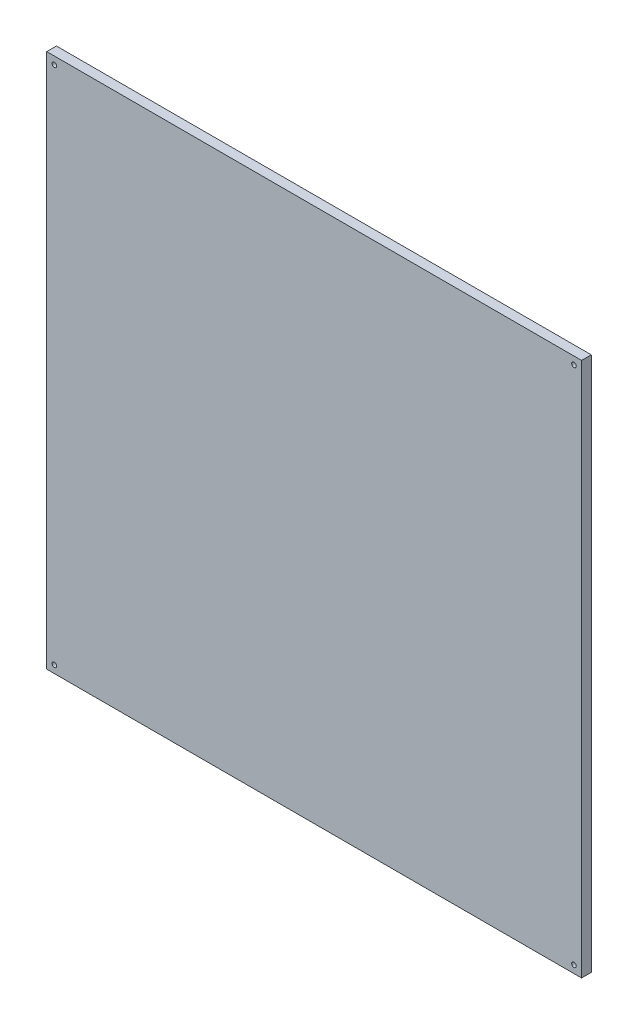
ISO-10303-21;
HEADER;
FILE_DESCRIPTION(('STEP AP214'),'2;1');
FILE_NAME('part.step','',(''),(''),'','','');
FILE_SCHEMA(('AUTOMOTIVE_DESIGN { 1 0 10303 214 1 1 1 1 }'));
ENDSEC;
DATA;
#1=APPLICATION_CONTEXT('core data for automotive mechanical design processes');
#2=APPLICATION_PROTOCOL_DEFINITION('international standard','automotive_design',2000,#1);
#3=PRODUCT_CONTEXT('',#1,'mechanical');
#4=PRODUCT('Part','Part','',(#3));
#5=PRODUCT_RELATED_PRODUCT_CATEGORY('part','',(#4));
#6=PRODUCT_DEFINITION_FORMATION('','',#4);
#7=PRODUCT_DEFINITION_CONTEXT('part definition',#1,'design');
#8=PRODUCT_DEFINITION('design','',#6,#7);
#9=PRODUCT_DEFINITION_SHAPE('','',#8);
#10=(LENGTH_UNIT() NAMED_UNIT(*) SI_UNIT(.MILLI.,.METRE.));
#11=(NAMED_UNIT(*) PLANE_ANGLE_UNIT() SI_UNIT($,.RADIAN.));
#12=(NAMED_UNIT(*) SI_UNIT($,.STERADIAN.) SOLID_ANGLE_UNIT());
#13=UNCERTAINTY_MEASURE_WITH_UNIT(LENGTH_MEASURE(1.E-05),#10,'distance_accuracy_value','');
#14=(GEOMETRIC_REPRESENTATION_CONTEXT(3) GLOBAL_UNCERTAINTY_ASSIGNED_CONTEXT((#13)) GLOBAL_UNIT_ASSIGNED_CONTEXT((#10,
#11,#12)) REPRESENTATION_CONTEXT('',''));
#15=CARTESIAN_POINT('',(0.,0.,0.));
#16=DIRECTION('',(0.,0.,1.));
#17=DIRECTION('',(1.,0.,0.));
#18=AXIS2_PLACEMENT_3D('',#15,#16,#17);
#19=CARTESIAN_POINT('',(0.,0.,6.35));
#20=DIRECTION('',(1.,0.,0.));
#21=DIRECTION('',(0.,0.,-1.));
#22=AXIS2_PLACEMENT_3D('',#19,#20,#21);
#23=PLANE('',#22);
#24=DIRECTION('',(0.,-1.,0.));
#25=VECTOR('',#24,1.);
#26=CARTESIAN_POINT('',(0.,0.,0.));
#27=LINE('',#26,#25);
#28=CARTESIAN_POINT('',(0.,350.,0.));
#29=VERTEX_POINT('',#28);
#30=CARTESIAN_POINT('',(0.,0.,0.));
#31=VERTEX_POINT('',#30);
#32=EDGE_CURVE('E109',#29,#31,#27,.T.);
#33=ORIENTED_EDGE('',*,*,#32,.T.);
#34=DIRECTION('',(0.,0.,-1.));
#35=VECTOR('',#34,1.);
#36=CARTESIAN_POINT('',(0.,0.,6.35));
#37=LINE('',#36,#35);
#38=CARTESIAN_POINT('',(0.,0.,6.35));
#39=VERTEX_POINT('',#38);
#40=EDGE_CURVE('E11',#39,#31,#37,.T.);
#41=ORIENTED_EDGE('',*,*,#40,.F.);
#42=DIRECTION('',(0.,-1.,0.));
#43=VECTOR('',#42,1.);
#44=CARTESIAN_POINT('',(0.,0.,6.35));
#45=LINE('',#44,#43);
#46=CARTESIAN_POINT('',(0.,350.,6.35));
#47=VERTEX_POINT('',#46);
#48=EDGE_CURVE('E92',#47,#39,#45,.T.);
#49=ORIENTED_EDGE('',*,*,#48,.F.);
#50=DIRECTION('',(0.,0.,-1.));
#51=VECTOR('',#50,1.);
#52=CARTESIAN_POINT('',(0.,350.,6.35));
#53=LINE('',#52,#51);
#54=EDGE_CURVE('E105',#47,#29,#53,.T.);
#55=ORIENTED_EDGE('',*,*,#54,.T.);
#56=EDGE_LOOP('',(#33,#41,#49,#55));
#57=FACE_BOUND('',#56,.T.);
#58=ADVANCED_FACE('F38',(#57),#23,.F.);
#59=CARTESIAN_POINT('',(0.,0.,6.35));
#60=DIRECTION('',(0.,1.,0.));
#61=DIRECTION('',(0.,0.,1.));
#62=AXIS2_PLACEMENT_3D('',#59,#60,#61);
#63=PLANE('',#62);
#64=DIRECTION('',(1.,0.,0.));
#65=VECTOR('',#64,1.);
#66=CARTESIAN_POINT('',(0.,0.,0.));
#67=LINE('',#66,#65);
#68=CARTESIAN_POINT('',(350.,0.,0.));
#69=VERTEX_POINT('',#68);
#70=EDGE_CURVE('E97',#31,#69,#67,.T.);
#71=ORIENTED_EDGE('',*,*,#70,.T.);
#72=DIRECTION('',(0.,0.,-1.));
#73=VECTOR('',#72,1.);
#74=CARTESIAN_POINT('',(350.,0.,6.35));
#75=LINE('',#74,#73);
#76=CARTESIAN_POINT('',(350.,0.,6.35));
#77=VERTEX_POINT('',#76);
#78=EDGE_CURVE('E48',#77,#69,#75,.T.);
#79=ORIENTED_EDGE('',*,*,#78,.F.);
#80=DIRECTION('',(1.,0.,0.));
#81=VECTOR('',#80,1.);
#82=CARTESIAN_POINT('',(0.,0.,6.35));
#83=LINE('',#82,#81);
#84=EDGE_CURVE('E87',#39,#77,#83,.T.);
#85=ORIENTED_EDGE('',*,*,#84,.F.);
#86=ORIENTED_EDGE('',*,*,#40,.T.);
#87=EDGE_LOOP('',(#71,#79,#85,#86));
#88=FACE_BOUND('',#87,.T.);
#89=ADVANCED_FACE('F96',(#88),#63,.F.);
#90=CARTESIAN_POINT('',(350.,0.,6.35));
#91=DIRECTION('',(-1.,0.,0.));
#92=DIRECTION('',(0.,-1.,0.));
#93=AXIS2_PLACEMENT_3D('',#90,#91,#92);
#94=PLANE('',#93);
#95=DIRECTION('',(0.,1.,0.));
#96=VECTOR('',#95,1.);
#97=CARTESIAN_POINT('',(350.,0.,0.));
#98=LINE('',#97,#96);
#99=CARTESIAN_POINT('',(350.,350.,0.));
#100=VERTEX_POINT('',#99);
#101=EDGE_CURVE('E74',#69,#100,#98,.T.);
#102=ORIENTED_EDGE('',*,*,#101,.T.);
#103=DIRECTION('',(0.,0.,-1.));
#104=VECTOR('',#103,1.);
#105=CARTESIAN_POINT('',(350.,350.,6.35));
#106=LINE('',#105,#104);
#107=CARTESIAN_POINT('',(350.,350.,6.35));
#108=VERTEX_POINT('',#107);
#109=EDGE_CURVE('E99',#108,#100,#106,.T.);
#110=ORIENTED_EDGE('',*,*,#109,.F.);
#111=DIRECTION('',(0.,1.,0.));
#112=VECTOR('',#111,1.);
#113=CARTESIAN_POINT('',(350.,0.,6.35));
#114=LINE('',#113,#112);
#115=EDGE_CURVE('E90',#77,#108,#114,.T.);
#116=ORIENTED_EDGE('',*,*,#115,.F.);
#117=ORIENTED_EDGE('',*,*,#78,.T.);
#118=EDGE_LOOP('',(#102,#110,#116,#117));
#119=FACE_BOUND('',#118,.T.);
#120=ADVANCED_FACE('F101',(#119),#94,.F.);
#121=CARTESIAN_POINT('',(0.,350.,6.35));
#122=DIRECTION('',(0.,-1.,0.));
#123=DIRECTION('',(0.,0.,-1.));
#124=AXIS2_PLACEMENT_3D('',#121,#122,#123);
#125=PLANE('',#124);
#126=DIRECTION('',(-1.,0.,0.));
#127=VECTOR('',#126,1.);
#128=CARTESIAN_POINT('',(0.,350.,0.));
#129=LINE('',#128,#127);
#130=EDGE_CURVE('E80',#100,#29,#129,.T.);
#131=ORIENTED_EDGE('',*,*,#130,.T.);
#132=ORIENTED_EDGE('',*,*,#54,.F.);
#133=DIRECTION('',(-1.,0.,0.));
#134=VECTOR('',#133,1.);
#135=CARTESIAN_POINT('',(0.,350.,6.35));
#136=LINE('',#135,#134);
#137=EDGE_CURVE('E57',#108,#47,#136,.T.);
#138=ORIENTED_EDGE('',*,*,#137,.F.);
#139=ORIENTED_EDGE('',*,*,#109,.T.);
#140=EDGE_LOOP('',(#131,#132,#138,#139));
#141=FACE_BOUND('',#140,.T.);
#142=ADVANCED_FACE('F165',(#141),#125,.F.);
#143=CARTESIAN_POINT('',(0.,0.,6.35));
#144=DIRECTION('',(0.,0.,-1.));
#145=DIRECTION('',(-1.,0.,0.));
#146=AXIS2_PLACEMENT_3D('',#143,#144,#145);
#147=PLANE('',#146);
#148=CARTESIAN_POINT('',(345.019620057682,344.999999999999,6.35));
#149=DIRECTION('',(0.,0.,1.));
#150=DIRECTION('',(0.,-1.,0.));
#151=AXIS2_PLACEMENT_3D('',#148,#149,#150);
#152=CIRCLE('',#151,1.5);
#153=CARTESIAN_POINT('',(345.019620057682,343.499999999999,6.35));
#154=VERTEX_POINT('',#153);
#155=EDGE_CURVE('E132',#154,#154,#152,.T.);
#156=ORIENTED_EDGE('',*,*,#155,.F.);
#157=EDGE_LOOP('',(#156));
#158=FACE_BOUND('',#157,.T.);
#159=CARTESIAN_POINT('',(345.019620057682,4.98037994231826,6.35));
#160=DIRECTION('',(0.,0.,1.));
#161=DIRECTION('',(-1.,0.,0.));
#162=AXIS2_PLACEMENT_3D('',#159,#160,#161);
#163=CIRCLE('',#162,1.5);
#164=CARTESIAN_POINT('',(343.519620057682,4.98037994231826,6.35));
#165=VERTEX_POINT('',#164);
#166=EDGE_CURVE('E152',#165,#165,#163,.T.);
#167=ORIENTED_EDGE('',*,*,#166,.F.);
#168=EDGE_LOOP('',(#167));
#169=FACE_BOUND('',#168,.T.);
#170=CARTESIAN_POINT('',(4.99999999999817,4.98037994232006,6.35));
#171=DIRECTION('',(0.,0.,1.));
#172=DIRECTION('',(0.,1.,0.));
#173=AXIS2_PLACEMENT_3D('',#170,#171,#172);
#174=CIRCLE('',#173,1.5);
#175=CARTESIAN_POINT('',(4.99999999999819,6.48037994232006,6.35));
#176=VERTEX_POINT('',#175);
#177=EDGE_CURVE('E147',#176,#176,#174,.T.);
#178=ORIENTED_EDGE('',*,*,#177,.F.);
#179=EDGE_LOOP('',(#178));
#180=FACE_BOUND('',#179,.T.);
#181=CARTESIAN_POINT('',(5.,345.,6.35));
#182=DIRECTION('',(0.,0.,1.));
#183=DIRECTION('',(1.,0.,0.));
#184=AXIS2_PLACEMENT_3D('',#181,#182,#183);
#185=CIRCLE('',#184,1.5);
#186=CARTESIAN_POINT('',(6.5,345.,6.35));
#187=VERTEX_POINT('',#186);
#188=EDGE_CURVE('E127',#187,#187,#185,.T.);
#189=ORIENTED_EDGE('',*,*,#188,.F.);
#190=EDGE_LOOP('',(#189));
#191=FACE_BOUND('',#190,.T.);
#192=ORIENTED_EDGE('',*,*,#48,.T.);
#193=ORIENTED_EDGE('',*,*,#84,.T.);
#194=ORIENTED_EDGE('',*,*,#115,.T.);
#195=ORIENTED_EDGE('',*,*,#137,.T.);
#196=EDGE_LOOP('',(#192,#193,#194,#195));
#197=FACE_BOUND('',#196,.T.);
#198=ADVANCED_FACE('F88',(#158,#169,#180,#191,#197),#147,.F.);
#199=CARTESIAN_POINT('',(0.,0.,0.));
#200=DIRECTION('',(0.,0.,-1.));
#201=DIRECTION('',(-1.,0.,0.));
#202=AXIS2_PLACEMENT_3D('',#199,#200,#201);
#203=PLANE('',#202);
#204=CARTESIAN_POINT('',(345.019620057682,344.999999999999,0.));
#205=DIRECTION('',(0.,0.,-1.));
#206=DIRECTION('',(-1.,0.,0.));
#207=AXIS2_PLACEMENT_3D('',#204,#205,#206);
#208=CIRCLE('',#207,1.5);
#209=CARTESIAN_POINT('',(343.519620057682,344.999999999999,0.));
#210=VERTEX_POINT('',#209);
#211=EDGE_CURVE('E41',#210,#210,#208,.T.);
#212=ORIENTED_EDGE('',*,*,#211,.F.);
#213=EDGE_LOOP('',(#212));
#214=FACE_BOUND('',#213,.T.);
#215=CARTESIAN_POINT('',(345.019620057682,4.98037994231826,0.));
#216=DIRECTION('',(0.,0.,-1.));
#217=DIRECTION('',(-1.,0.,0.));
#218=AXIS2_PLACEMENT_3D('',#215,#216,#217);
#219=CIRCLE('',#218,1.5);
#220=CARTESIAN_POINT('',(343.519620057682,4.98037994231826,0.));
#221=VERTEX_POINT('',#220);
#222=EDGE_CURVE('E131',#221,#221,#219,.T.);
#223=ORIENTED_EDGE('',*,*,#222,.F.);
#224=EDGE_LOOP('',(#223));
#225=FACE_BOUND('',#224,.T.);
#226=CARTESIAN_POINT('',(4.99999999999817,4.98037994232006,0.));
#227=DIRECTION('',(0.,0.,-1.));
#228=DIRECTION('',(-1.,0.,0.));
#229=AXIS2_PLACEMENT_3D('',#226,#227,#228);
#230=CIRCLE('',#229,1.5);
#231=CARTESIAN_POINT('',(3.49999999999817,4.98037994232006,0.));
#232=VERTEX_POINT('',#231);
#233=EDGE_CURVE('E128',#232,#232,#230,.T.);
#234=ORIENTED_EDGE('',*,*,#233,.F.);
#235=EDGE_LOOP('',(#234));
#236=FACE_BOUND('',#235,.T.);
#237=CARTESIAN_POINT('',(5.,345.,0.));
#238=DIRECTION('',(0.,0.,-1.));
#239=DIRECTION('',(-1.,0.,0.));
#240=AXIS2_PLACEMENT_3D('',#237,#238,#239);
#241=CIRCLE('',#240,1.5);
#242=CARTESIAN_POINT('',(3.5,345.,0.));
#243=VERTEX_POINT('',#242);
#244=EDGE_CURVE('E113',#243,#243,#241,.T.);
#245=ORIENTED_EDGE('',*,*,#244,.F.);
#246=EDGE_LOOP('',(#245));
#247=FACE_BOUND('',#246,.T.);
#248=ORIENTED_EDGE('',*,*,#32,.F.);
#249=ORIENTED_EDGE('',*,*,#130,.F.);
#250=ORIENTED_EDGE('',*,*,#101,.F.);
#251=ORIENTED_EDGE('',*,*,#70,.F.);
#252=EDGE_LOOP('',(#248,#249,#250,#251));
#253=FACE_BOUND('',#252,.T.);
#254=ADVANCED_FACE('F164',(#214,#225,#236,#247,#253),#203,.T.);
#255=CARTESIAN_POINT('',(5.,345.,-3.65));
#256=DIRECTION('',(0.,0.,1.));
#257=DIRECTION('',(1.,0.,0.));
#258=AXIS2_PLACEMENT_3D('',#255,#256,#257);
#259=CYLINDRICAL_SURFACE('',#258,1.5);
#260=ORIENTED_EDGE('',*,*,#244,.T.);
#261=EDGE_LOOP('',(#260));
#262=FACE_BOUND('',#261,.T.);
#263=ORIENTED_EDGE('',*,*,#188,.T.);
#264=EDGE_LOOP('',(#263));
#265=FACE_BOUND('',#264,.T.);
#266=ADVANCED_FACE('F175',(#262,#265),#259,.F.);
#267=CARTESIAN_POINT('',(4.99999999999817,4.98037994232006,-3.65));
#268=DIRECTION('',(0.,0.,1.));
#269=DIRECTION('',(1.,0.,0.));
#270=AXIS2_PLACEMENT_3D('',#267,#268,#269);
#271=CYLINDRICAL_SURFACE('',#270,1.5);
#272=ORIENTED_EDGE('',*,*,#233,.T.);
#273=EDGE_LOOP('',(#272));
#274=FACE_BOUND('',#273,.T.);
#275=ORIENTED_EDGE('',*,*,#177,.T.);
#276=EDGE_LOOP('',(#275));
#277=FACE_BOUND('',#276,.T.);
#278=ADVANCED_FACE('F172',(#274,#277),#271,.F.);
#279=CARTESIAN_POINT('',(345.019620057682,4.98037994231826,-3.65));
#280=DIRECTION('',(0.,0.,1.));
#281=DIRECTION('',(1.,0.,0.));
#282=AXIS2_PLACEMENT_3D('',#279,#280,#281);
#283=CYLINDRICAL_SURFACE('',#282,1.5);
#284=ORIENTED_EDGE('',*,*,#222,.T.);
#285=EDGE_LOOP('',(#284));
#286=FACE_BOUND('',#285,.T.);
#287=ORIENTED_EDGE('',*,*,#166,.T.);
#288=EDGE_LOOP('',(#287));
#289=FACE_BOUND('',#288,.T.);
#290=ADVANCED_FACE('F174',(#286,#289),#283,.F.);
#291=CARTESIAN_POINT('',(345.019620057682,344.999999999999,-3.65));
#292=DIRECTION('',(0.,0.,1.));
#293=DIRECTION('',(1.,0.,0.));
#294=AXIS2_PLACEMENT_3D('',#291,#292,#293);
#295=CYLINDRICAL_SURFACE('',#294,1.5);
#296=ORIENTED_EDGE('',*,*,#211,.T.);
#297=EDGE_LOOP('',(#296));
#298=FACE_BOUND('',#297,.T.);
#299=ORIENTED_EDGE('',*,*,#155,.T.);
#300=EDGE_LOOP('',(#299));
#301=FACE_BOUND('',#300,.T.);
#302=ADVANCED_FACE('F160',(#298,#301),#295,.F.);
#303=CLOSED_SHELL('',(#58,#89,#120,#142,#198,#254,#266,#278,#290,#302));
#304=MANIFOLD_SOLID_BREP('B2',#303);
#305=ADVANCED_BREP_SHAPE_REPRESENTATION('',(#18,#304),#14);
#306=SHAPE_DEFINITION_REPRESENTATION(#9,#305);
ENDSEC;
END-ISO-10303-21;
